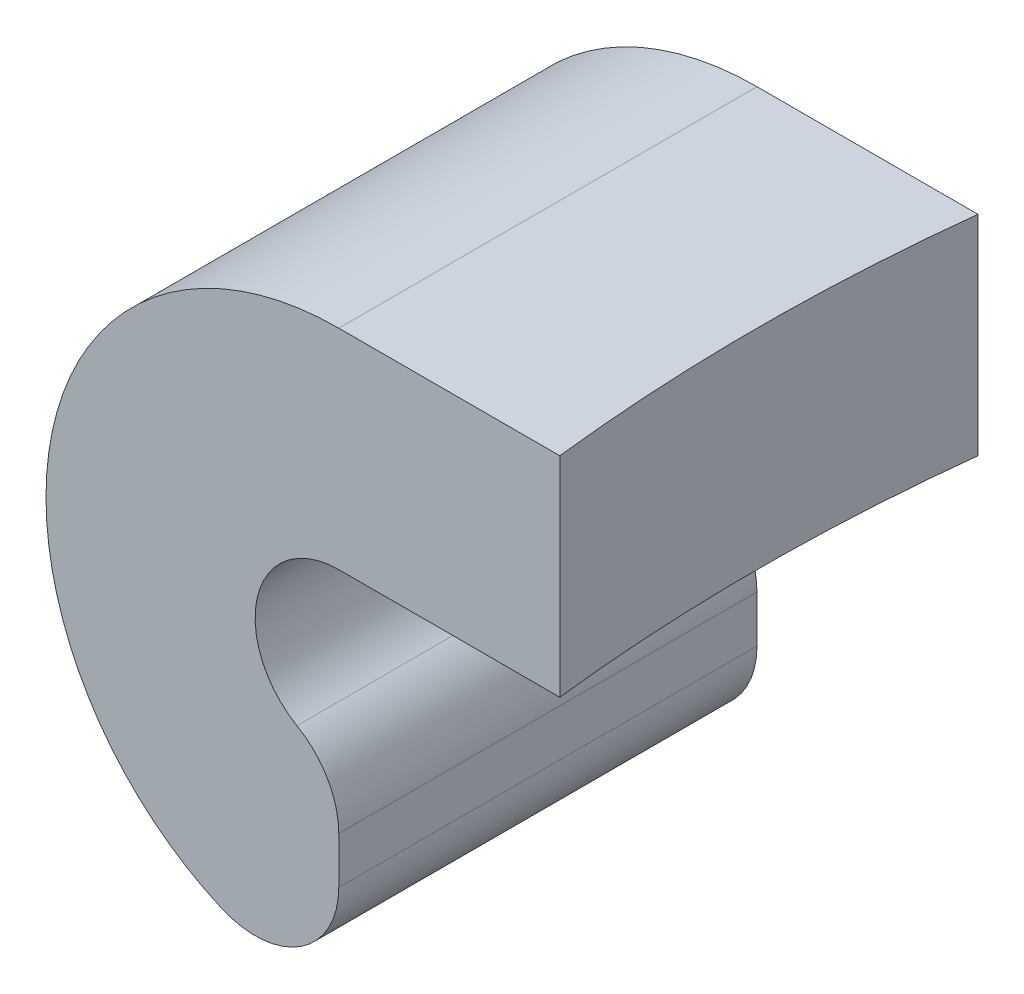
ISO-10303-21;
HEADER;
FILE_DESCRIPTION(('STEP AP214'),'2;1');
FILE_NAME('part.step','',(''),(''),'','','');
FILE_SCHEMA(('AUTOMOTIVE_DESIGN { 1 0 10303 214 1 1 1 1 }'));
ENDSEC;
DATA;
#1=APPLICATION_CONTEXT('core data for automotive mechanical design processes');
#2=APPLICATION_PROTOCOL_DEFINITION('international standard','automotive_design',2000,#1);
#3=PRODUCT_CONTEXT('',#1,'mechanical');
#4=PRODUCT('Part','Part','',(#3));
#5=PRODUCT_RELATED_PRODUCT_CATEGORY('part','',(#4));
#6=PRODUCT_DEFINITION_FORMATION('','',#4);
#7=PRODUCT_DEFINITION_CONTEXT('part definition',#1,'design');
#8=PRODUCT_DEFINITION('design','',#6,#7);
#9=PRODUCT_DEFINITION_SHAPE('','',#8);
#10=(LENGTH_UNIT() NAMED_UNIT(*) SI_UNIT(.MILLI.,.METRE.));
#11=(NAMED_UNIT(*) PLANE_ANGLE_UNIT() SI_UNIT($,.RADIAN.));
#12=(NAMED_UNIT(*) SI_UNIT($,.STERADIAN.) SOLID_ANGLE_UNIT());
#13=UNCERTAINTY_MEASURE_WITH_UNIT(LENGTH_MEASURE(1.E-05),#10,'distance_accuracy_value','');
#14=(GEOMETRIC_REPRESENTATION_CONTEXT(3) GLOBAL_UNCERTAINTY_ASSIGNED_CONTEXT((#13)) GLOBAL_UNIT_ASSIGNED_CONTEXT((#10,
#11,#12)) REPRESENTATION_CONTEXT('',''));
#15=CARTESIAN_POINT('',(0.,0.,0.));
#16=DIRECTION('',(0.,0.,1.));
#17=DIRECTION('',(1.,0.,0.));
#18=AXIS2_PLACEMENT_3D('',#15,#16,#17);
#19=CARTESIAN_POINT('',(0.,0.,2.5));
#20=DIRECTION('',(0.,0.,1.));
#21=DIRECTION('',(1.,0.,0.));
#22=AXIS2_PLACEMENT_3D('',#19,#20,#21);
#23=PLANE('',#22);
#24=DIRECTION('',(1.,0.,0.));
#25=VECTOR('',#24,1.);
#26=CARTESIAN_POINT('',(0.,0.,2.5));
#27=LINE('',#26,#25);
#28=CARTESIAN_POINT('',(0.,0.,2.5));
#29=VERTEX_POINT('',#28);
#30=CARTESIAN_POINT('',(2.6425070056056,0.,2.5));
#31=VERTEX_POINT('',#30);
#32=EDGE_CURVE('E171',#29,#31,#27,.T.);
#33=ORIENTED_EDGE('',*,*,#32,.T.);
#34=DIRECTION('',(0.,-1.,0.));
#35=VECTOR('',#34,1.);
#36=CARTESIAN_POINT('',(2.6425070056056,2.5,2.5));
#37=LINE('',#36,#35);
#38=CARTESIAN_POINT('',(2.6425070056056,2.5,2.5));
#39=VERTEX_POINT('',#38);
#40=EDGE_CURVE('E138',#31,#39,#37,.F.);
#41=ORIENTED_EDGE('',*,*,#40,.T.);
#42=DIRECTION('',(1.,0.,0.));
#43=VECTOR('',#42,1.);
#44=CARTESIAN_POINT('',(0.,2.5,2.5));
#45=LINE('',#44,#43);
#46=CARTESIAN_POINT('',(0.,2.5,2.5));
#47=VERTEX_POINT('',#46);
#48=EDGE_CURVE('E115',#47,#39,#45,.T.);
#49=ORIENTED_EDGE('',*,*,#48,.F.);
#50=CARTESIAN_POINT('',(0.,-1.,2.5));
#51=DIRECTION('',(0.,0.,1.));
#52=DIRECTION('',(1.,0.,0.));
#53=AXIS2_PLACEMENT_3D('',#50,#51,#52);
#54=CIRCLE('',#53,3.5);
#55=CARTESIAN_POINT('',(-1.4,-4.20780298646909,2.5));
#56=VERTEX_POINT('',#55);
#57=EDGE_CURVE('E106',#47,#56,#54,.T.);
#58=ORIENTED_EDGE('',*,*,#57,.T.);
#59=CARTESIAN_POINT('',(-1.,-3.29128784747792,2.5));
#60=DIRECTION('',(0.,0.,1.));
#61=DIRECTION('',(1.,0.,0.));
#62=AXIS2_PLACEMENT_3D('',#59,#60,#61);
#63=CIRCLE('',#62,1.);
#64=CARTESIAN_POINT('',(0.,-3.29128784747792,2.5));
#65=VERTEX_POINT('',#64);
#66=EDGE_CURVE('E111',#56,#65,#63,.T.);
#67=ORIENTED_EDGE('',*,*,#66,.T.);
#68=DIRECTION('',(0.,-1.,0.));
#69=VECTOR('',#68,1.);
#70=CARTESIAN_POINT('',(0.,0.,2.5));
#71=LINE('',#70,#69);
#72=CARTESIAN_POINT('',(0.,-2.73205080756888,2.5));
#73=VERTEX_POINT('',#72);
#74=EDGE_CURVE('E130',#73,#65,#71,.T.);
#75=ORIENTED_EDGE('',*,*,#74,.F.);
#76=CARTESIAN_POINT('',(-1.,-2.73205080756888,2.5));
#77=DIRECTION('',(0.,0.,1.));
#78=DIRECTION('',(1.,0.,0.));
#79=AXIS2_PLACEMENT_3D('',#76,#77,#78);
#80=CIRCLE('',#79,1.);
#81=CARTESIAN_POINT('',(-0.5,-1.86602540378444,2.5));
#82=VERTEX_POINT('',#81);
#83=EDGE_CURVE('E153',#82,#73,#80,.F.);
#84=ORIENTED_EDGE('',*,*,#83,.F.);
#85=CARTESIAN_POINT('',(0.,-1.,2.5));
#86=DIRECTION('',(0.,0.,1.));
#87=DIRECTION('',(1.,0.,0.));
#88=AXIS2_PLACEMENT_3D('',#85,#86,#87);
#89=CIRCLE('',#88,1.);
#90=EDGE_CURVE('E163',#29,#82,#89,.T.);
#91=ORIENTED_EDGE('',*,*,#90,.F.);
#92=EDGE_LOOP('',(#33,#41,#49,#58,#67,#75,#84,#91));
#93=FACE_BOUND('',#92,.T.);
#94=ADVANCED_FACE('F41',(#93),#23,.T.);
#95=CARTESIAN_POINT('',(0.,0.,-2.5));
#96=DIRECTION('',(0.,0.,1.));
#97=DIRECTION('',(1.,0.,0.));
#98=AXIS2_PLACEMENT_3D('',#95,#96,#97);
#99=PLANE('',#98);
#100=DIRECTION('',(0.,-1.,0.));
#101=VECTOR('',#100,1.);
#102=CARTESIAN_POINT('',(2.6425070056056,2.5,-2.5));
#103=LINE('',#102,#101);
#104=CARTESIAN_POINT('',(2.6425070056056,0.,-2.5));
#105=VERTEX_POINT('',#104);
#106=CARTESIAN_POINT('',(2.6425070056056,2.5,-2.5));
#107=VERTEX_POINT('',#106);
#108=EDGE_CURVE('E11',#105,#107,#103,.F.);
#109=ORIENTED_EDGE('',*,*,#108,.F.);
#110=DIRECTION('',(1.,0.,0.));
#111=VECTOR('',#110,1.);
#112=CARTESIAN_POINT('',(0.,0.,-2.5));
#113=LINE('',#112,#111);
#114=CARTESIAN_POINT('',(0.,0.,-2.5));
#115=VERTEX_POINT('',#114);
#116=EDGE_CURVE('E141',#115,#105,#113,.T.);
#117=ORIENTED_EDGE('',*,*,#116,.F.);
#118=CARTESIAN_POINT('',(0.,-1.,-2.5));
#119=DIRECTION('',(0.,0.,1.));
#120=DIRECTION('',(1.,0.,0.));
#121=AXIS2_PLACEMENT_3D('',#118,#119,#120);
#122=CIRCLE('',#121,1.);
#123=CARTESIAN_POINT('',(-0.5,-1.86602540378444,-2.5));
#124=VERTEX_POINT('',#123);
#125=EDGE_CURVE('E137',#115,#124,#122,.T.);
#126=ORIENTED_EDGE('',*,*,#125,.T.);
#127=CARTESIAN_POINT('',(-1.,-2.73205080756888,-2.5));
#128=DIRECTION('',(0.,0.,1.));
#129=DIRECTION('',(1.,0.,0.));
#130=AXIS2_PLACEMENT_3D('',#127,#128,#129);
#131=CIRCLE('',#130,1.);
#132=CARTESIAN_POINT('',(0.,-2.73205080756888,-2.5));
#133=VERTEX_POINT('',#132);
#134=EDGE_CURVE('E135',#124,#133,#131,.F.);
#135=ORIENTED_EDGE('',*,*,#134,.T.);
#136=DIRECTION('',(0.,-1.,0.));
#137=VECTOR('',#136,1.);
#138=CARTESIAN_POINT('',(0.,0.,-2.5));
#139=LINE('',#138,#137);
#140=CARTESIAN_POINT('',(0.,-3.29128784747792,-2.5));
#141=VERTEX_POINT('',#140);
#142=EDGE_CURVE('E150',#133,#141,#139,.T.);
#143=ORIENTED_EDGE('',*,*,#142,.T.);
#144=CARTESIAN_POINT('',(-1.,-3.29128784747792,-2.5));
#145=DIRECTION('',(0.,0.,1.));
#146=DIRECTION('',(1.,0.,0.));
#147=AXIS2_PLACEMENT_3D('',#144,#145,#146);
#148=CIRCLE('',#147,1.);
#149=CARTESIAN_POINT('',(-1.4,-4.20780298646909,-2.5));
#150=VERTEX_POINT('',#149);
#151=EDGE_CURVE('E148',#150,#141,#148,.T.);
#152=ORIENTED_EDGE('',*,*,#151,.F.);
#153=CARTESIAN_POINT('',(0.,-1.,-2.5));
#154=DIRECTION('',(0.,0.,1.));
#155=DIRECTION('',(1.,0.,0.));
#156=AXIS2_PLACEMENT_3D('',#153,#154,#155);
#157=CIRCLE('',#156,3.5);
#158=CARTESIAN_POINT('',(0.,2.5,-2.5));
#159=VERTEX_POINT('',#158);
#160=EDGE_CURVE('E122',#159,#150,#157,.T.);
#161=ORIENTED_EDGE('',*,*,#160,.F.);
#162=DIRECTION('',(1.,0.,0.));
#163=VECTOR('',#162,1.);
#164=CARTESIAN_POINT('',(0.,2.5,-2.5));
#165=LINE('',#164,#163);
#166=EDGE_CURVE('E144',#159,#107,#165,.T.);
#167=ORIENTED_EDGE('',*,*,#166,.T.);
#168=EDGE_LOOP('',(#109,#117,#126,#135,#143,#152,#161,#167));
#169=FACE_BOUND('',#168,.T.);
#170=ADVANCED_FACE('F166',(#169),#99,.F.);
#171=CARTESIAN_POINT('',(-1.,-2.73205080756888,2.5));
#172=DIRECTION('',(0.,0.,-1.));
#173=DIRECTION('',(-1.,0.,0.));
#174=AXIS2_PLACEMENT_3D('',#171,#172,#173);
#175=CYLINDRICAL_SURFACE('',#174,1.);
#176=ORIENTED_EDGE('',*,*,#134,.F.);
#177=DIRECTION('',(0.,0.,-1.));
#178=VECTOR('',#177,1.);
#179=CARTESIAN_POINT('',(-0.5,-1.86602540378444,2.5));
#180=LINE('',#179,#178);
#181=EDGE_CURVE('E49',#82,#124,#180,.T.);
#182=ORIENTED_EDGE('',*,*,#181,.F.);
#183=ORIENTED_EDGE('',*,*,#83,.T.);
#184=DIRECTION('',(0.,0.,-1.));
#185=VECTOR('',#184,1.);
#186=CARTESIAN_POINT('',(0.,-2.73205080756888,2.5));
#187=LINE('',#186,#185);
#188=EDGE_CURVE('E64',#73,#133,#187,.T.);
#189=ORIENTED_EDGE('',*,*,#188,.T.);
#190=EDGE_LOOP('',(#176,#182,#183,#189));
#191=FACE_BOUND('',#190,.T.);
#192=ADVANCED_FACE('F43',(#191),#175,.T.);
#193=CARTESIAN_POINT('',(0.,-1.,2.5));
#194=DIRECTION('',(0.,0.,-1.));
#195=DIRECTION('',(-1.,0.,0.));
#196=AXIS2_PLACEMENT_3D('',#193,#194,#195);
#197=CYLINDRICAL_SURFACE('',#196,1.);
#198=ORIENTED_EDGE('',*,*,#125,.F.);
#199=DIRECTION('',(0.,0.,-1.));
#200=VECTOR('',#199,1.);
#201=CARTESIAN_POINT('',(0.,0.,2.5));
#202=LINE('',#201,#200);
#203=EDGE_CURVE('E157',#29,#115,#202,.T.);
#204=ORIENTED_EDGE('',*,*,#203,.F.);
#205=ORIENTED_EDGE('',*,*,#90,.T.);
#206=ORIENTED_EDGE('',*,*,#181,.T.);
#207=EDGE_LOOP('',(#198,#204,#205,#206));
#208=FACE_BOUND('',#207,.T.);
#209=ADVANCED_FACE('F161',(#208),#197,.F.);
#210=CARTESIAN_POINT('',(0.,0.,2.5));
#211=DIRECTION('',(0.,1.,0.));
#212=DIRECTION('',(0.,0.,1.));
#213=AXIS2_PLACEMENT_3D('',#210,#211,#212);
#214=PLANE('',#213);
#215=CARTESIAN_POINT('',(24.5,0.,0.));
#216=DIRECTION('',(0.,1.,0.));
#217=DIRECTION('',(0.,0.,1.));
#218=AXIS2_PLACEMENT_3D('',#215,#216,#217);
#219=CIRCLE('',#218,22.);
#220=EDGE_CURVE('E55',#105,#31,#219,.T.);
#221=ORIENTED_EDGE('',*,*,#220,.T.);
#222=ORIENTED_EDGE('',*,*,#32,.F.);
#223=ORIENTED_EDGE('',*,*,#203,.T.);
#224=ORIENTED_EDGE('',*,*,#116,.T.);
#225=EDGE_LOOP('',(#221,#222,#223,#224));
#226=FACE_BOUND('',#225,.T.);
#227=ADVANCED_FACE('F168',(#226),#214,.F.);
#228=CARTESIAN_POINT('',(0.,2.5,2.5));
#229=DIRECTION('',(0.,1.,0.));
#230=DIRECTION('',(-1.,0.,0.));
#231=AXIS2_PLACEMENT_3D('',#228,#229,#230);
#232=PLANE('',#231);
#233=ORIENTED_EDGE('',*,*,#48,.T.);
#234=CARTESIAN_POINT('',(24.5,2.5,0.));
#235=DIRECTION('',(0.,1.,0.));
#236=DIRECTION('',(0.,0.,1.));
#237=AXIS2_PLACEMENT_3D('',#234,#235,#236);
#238=CIRCLE('',#237,22.);
#239=EDGE_CURVE('E182',#107,#39,#238,.T.);
#240=ORIENTED_EDGE('',*,*,#239,.F.);
#241=ORIENTED_EDGE('',*,*,#166,.F.);
#242=DIRECTION('',(0.,0.,-1.));
#243=VECTOR('',#242,1.);
#244=CARTESIAN_POINT('',(0.,2.5,2.5));
#245=LINE('',#244,#243);
#246=EDGE_CURVE('E126',#47,#159,#245,.T.);
#247=ORIENTED_EDGE('',*,*,#246,.F.);
#248=EDGE_LOOP('',(#233,#240,#241,#247));
#249=FACE_BOUND('',#248,.T.);
#250=ADVANCED_FACE('F178',(#249),#232,.T.);
#251=CARTESIAN_POINT('',(0.,-1.,2.5));
#252=DIRECTION('',(0.,0.,-1.));
#253=DIRECTION('',(-1.,0.,0.));
#254=AXIS2_PLACEMENT_3D('',#251,#252,#253);
#255=CYLINDRICAL_SURFACE('',#254,3.5);
#256=ORIENTED_EDGE('',*,*,#160,.T.);
#257=DIRECTION('',(0.,0.,-1.));
#258=VECTOR('',#257,1.);
#259=CARTESIAN_POINT('',(-1.4,-4.20780298646909,2.5));
#260=LINE('',#259,#258);
#261=EDGE_CURVE('E119',#56,#150,#260,.T.);
#262=ORIENTED_EDGE('',*,*,#261,.F.);
#263=ORIENTED_EDGE('',*,*,#57,.F.);
#264=ORIENTED_EDGE('',*,*,#246,.T.);
#265=EDGE_LOOP('',(#256,#262,#263,#264));
#266=FACE_BOUND('',#265,.T.);
#267=ADVANCED_FACE('F120',(#266),#255,.T.);
#268=CARTESIAN_POINT('',(-1.,-3.29128784747792,2.5));
#269=DIRECTION('',(0.,0.,-1.));
#270=DIRECTION('',(-1.,0.,0.));
#271=AXIS2_PLACEMENT_3D('',#268,#269,#270);
#272=CYLINDRICAL_SURFACE('',#271,1.);
#273=ORIENTED_EDGE('',*,*,#151,.T.);
#274=DIRECTION('',(0.,0.,-1.));
#275=VECTOR('',#274,1.);
#276=CARTESIAN_POINT('',(0.,-3.29128784747792,2.5));
#277=LINE('',#276,#275);
#278=EDGE_CURVE('E127',#65,#141,#277,.T.);
#279=ORIENTED_EDGE('',*,*,#278,.F.);
#280=ORIENTED_EDGE('',*,*,#66,.F.);
#281=ORIENTED_EDGE('',*,*,#261,.T.);
#282=EDGE_LOOP('',(#273,#279,#280,#281));
#283=FACE_BOUND('',#282,.T.);
#284=ADVANCED_FACE('F129',(#283),#272,.T.);
#285=CARTESIAN_POINT('',(0.,0.,2.5));
#286=DIRECTION('',(1.,0.,0.));
#287=DIRECTION('',(0.,0.,-1.));
#288=AXIS2_PLACEMENT_3D('',#285,#286,#287);
#289=PLANE('',#288);
#290=ORIENTED_EDGE('',*,*,#142,.F.);
#291=ORIENTED_EDGE('',*,*,#188,.F.);
#292=ORIENTED_EDGE('',*,*,#74,.T.);
#293=ORIENTED_EDGE('',*,*,#278,.T.);
#294=EDGE_LOOP('',(#290,#291,#292,#293));
#295=FACE_BOUND('',#294,.T.);
#296=ADVANCED_FACE('F188',(#295),#289,.T.);
#297=CARTESIAN_POINT('',(24.5,2.5,0.));
#298=DIRECTION('',(0.,-1.,0.));
#299=DIRECTION('',(0.,0.,-1.));
#300=AXIS2_PLACEMENT_3D('',#297,#298,#299);
#301=CYLINDRICAL_SURFACE('',#300,22.);
#302=ORIENTED_EDGE('',*,*,#220,.F.);
#303=ORIENTED_EDGE('',*,*,#108,.T.);
#304=ORIENTED_EDGE('',*,*,#239,.T.);
#305=ORIENTED_EDGE('',*,*,#40,.F.);
#306=EDGE_LOOP('',(#302,#303,#304,#305));
#307=FACE_BOUND('',#306,.T.);
#308=ADVANCED_FACE('F184',(#307),#301,.F.);
#309=CLOSED_SHELL('',(#94,#170,#192,#209,#227,#250,#267,#284,#296,#308));
#310=MANIFOLD_SOLID_BREP('B2',#309);
#311=ADVANCED_BREP_SHAPE_REPRESENTATION('',(#18,#310),#14);
#312=SHAPE_DEFINITION_REPRESENTATION(#9,#311);
ENDSEC;
END-ISO-10303-21;
